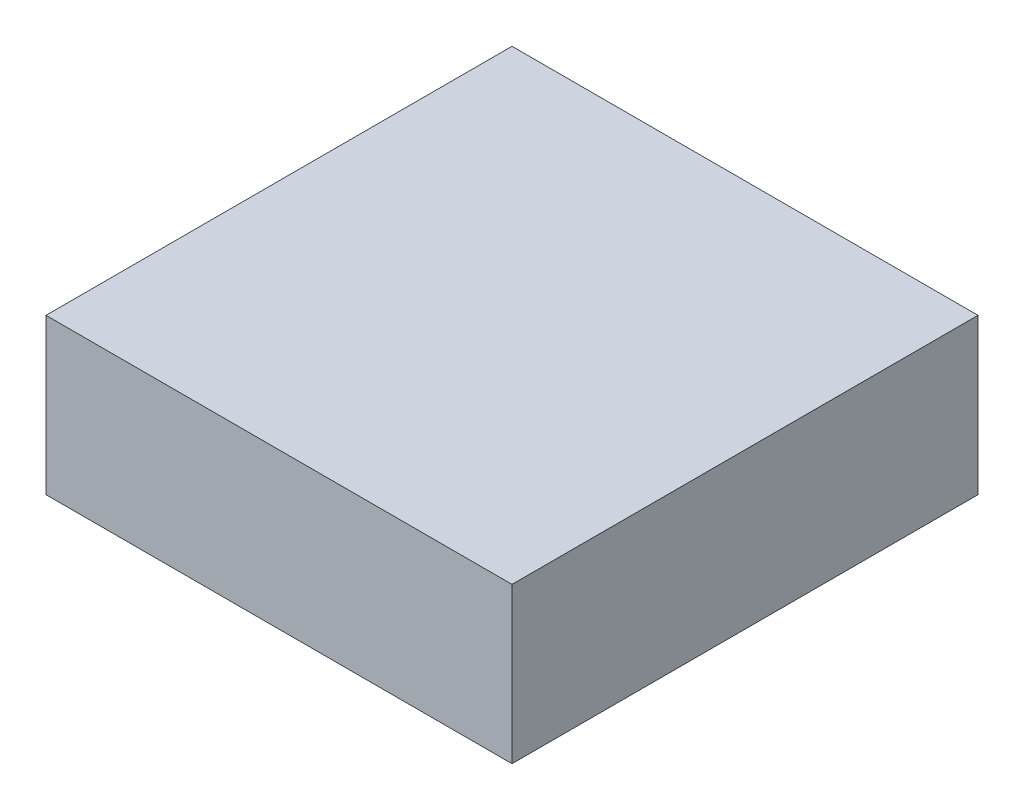
ISO-10303-21;
HEADER;
FILE_DESCRIPTION(('STEP AP214'),'2;1');
FILE_NAME('part.step','',(''),(''),'','','');
FILE_SCHEMA(('AUTOMOTIVE_DESIGN { 1 0 10303 214 1 1 1 1 }'));
ENDSEC;
DATA;
#1=APPLICATION_CONTEXT('core data for automotive mechanical design processes');
#2=APPLICATION_PROTOCOL_DEFINITION('international standard','automotive_design',2000,#1);
#3=PRODUCT_CONTEXT('',#1,'mechanical');
#4=PRODUCT('Part','Part','',(#3));
#5=PRODUCT_RELATED_PRODUCT_CATEGORY('part','',(#4));
#6=PRODUCT_DEFINITION_FORMATION('','',#4);
#7=PRODUCT_DEFINITION_CONTEXT('part definition',#1,'design');
#8=PRODUCT_DEFINITION('design','',#6,#7);
#9=PRODUCT_DEFINITION_SHAPE('','',#8);
#10=(LENGTH_UNIT() NAMED_UNIT(*) SI_UNIT(.MILLI.,.METRE.));
#11=(NAMED_UNIT(*) PLANE_ANGLE_UNIT() SI_UNIT($,.RADIAN.));
#12=(NAMED_UNIT(*) SI_UNIT($,.STERADIAN.) SOLID_ANGLE_UNIT());
#13=UNCERTAINTY_MEASURE_WITH_UNIT(LENGTH_MEASURE(1.E-05),#10,'distance_accuracy_value','');
#14=(GEOMETRIC_REPRESENTATION_CONTEXT(3) GLOBAL_UNCERTAINTY_ASSIGNED_CONTEXT((#13)) GLOBAL_UNIT_ASSIGNED_CONTEXT((#10,
#11,#12)) REPRESENTATION_CONTEXT('',''));
#15=CARTESIAN_POINT('',(0.,0.,0.));
#16=DIRECTION('',(0.,0.,1.));
#17=DIRECTION('',(1.,0.,0.));
#18=AXIS2_PLACEMENT_3D('',#15,#16,#17);
#19=CARTESIAN_POINT('',(0.,0.,0.));
#20=DIRECTION('',(0.,-1.,0.));
#21=DIRECTION('',(0.,0.,-1.));
#22=AXIS2_PLACEMENT_3D('',#19,#20,#21);
#23=PLANE('',#22);
#24=DIRECTION('',(0.,0.,-1.));
#25=VECTOR('',#24,1.);
#26=CARTESIAN_POINT('',(40.5,0.,40.5));
#27=LINE('',#26,#25);
#28=CARTESIAN_POINT('',(40.5,0.,40.5));
#29=VERTEX_POINT('',#28);
#30=CARTESIAN_POINT('',(40.5,0.,-40.5));
#31=VERTEX_POINT('',#30);
#32=EDGE_CURVE('E94',#29,#31,#27,.T.);
#33=ORIENTED_EDGE('',*,*,#32,.F.);
#34=DIRECTION('',(1.,0.,0.));
#35=VECTOR('',#34,1.);
#36=CARTESIAN_POINT('',(-40.5,0.,40.5));
#37=LINE('',#36,#35);
#38=CARTESIAN_POINT('',(-40.5,0.,40.5));
#39=VERTEX_POINT('',#38);
#40=EDGE_CURVE('E74',#39,#29,#37,.T.);
#41=ORIENTED_EDGE('',*,*,#40,.F.);
#42=DIRECTION('',(0.,0.,1.));
#43=VECTOR('',#42,1.);
#44=CARTESIAN_POINT('',(-40.5,0.,40.5));
#45=LINE('',#44,#43);
#46=CARTESIAN_POINT('',(-40.5,0.,-40.5));
#47=VERTEX_POINT('',#46);
#48=EDGE_CURVE('E68',#47,#39,#45,.T.);
#49=ORIENTED_EDGE('',*,*,#48,.F.);
#50=DIRECTION('',(-1.,0.,0.));
#51=VECTOR('',#50,1.);
#52=CARTESIAN_POINT('',(-40.5,0.,-40.5));
#53=LINE('',#52,#51);
#54=EDGE_CURVE('E97',#31,#47,#53,.T.);
#55=ORIENTED_EDGE('',*,*,#54,.F.);
#56=EDGE_LOOP('',(#33,#41,#49,#55));
#57=FACE_BOUND('',#56,.T.);
#58=CARTESIAN_POINT('',(0.,0.,0.));
#59=DIRECTION('',(0.,1.,0.));
#60=DIRECTION('',(-1.,0.,0.));
#61=AXIS2_PLACEMENT_3D('',#58,#59,#60);
#62=CIRCLE('',#61,31.5);
#63=CARTESIAN_POINT('',(-31.5,0.,0.));
#64=VERTEX_POINT('',#63);
#65=EDGE_CURVE('E92',#64,#64,#62,.T.);
#66=ORIENTED_EDGE('',*,*,#65,.T.);
#67=EDGE_LOOP('',(#66));
#68=FACE_BOUND('',#67,.T.);
#69=ADVANCED_FACE('F33',(#57,#68),#23,.T.);
#70=CARTESIAN_POINT('',(40.5,27.,40.5));
#71=DIRECTION('',(-1.,0.,0.));
#72=DIRECTION('',(0.,0.,1.));
#73=AXIS2_PLACEMENT_3D('',#70,#71,#72);
#74=PLANE('',#73);
#75=ORIENTED_EDGE('',*,*,#32,.T.);
#76=DIRECTION('',(0.,-1.,0.));
#77=VECTOR('',#76,1.);
#78=CARTESIAN_POINT('',(40.5,27.,-40.5));
#79=LINE('',#78,#77);
#80=CARTESIAN_POINT('',(40.5,27.,-40.5));
#81=VERTEX_POINT('',#80);
#82=EDGE_CURVE('E11',#81,#31,#79,.T.);
#83=ORIENTED_EDGE('',*,*,#82,.F.);
#84=DIRECTION('',(0.,0.,-1.));
#85=VECTOR('',#84,1.);
#86=CARTESIAN_POINT('',(40.5,27.,40.5));
#87=LINE('',#86,#85);
#88=CARTESIAN_POINT('',(40.5,27.,40.5));
#89=VERTEX_POINT('',#88);
#90=EDGE_CURVE('E104',#89,#81,#87,.T.);
#91=ORIENTED_EDGE('',*,*,#90,.F.);
#92=DIRECTION('',(0.,-1.,0.));
#93=VECTOR('',#92,1.);
#94=CARTESIAN_POINT('',(40.5,27.,40.5));
#95=LINE('',#94,#93);
#96=EDGE_CURVE('E109',#89,#29,#95,.T.);
#97=ORIENTED_EDGE('',*,*,#96,.T.);
#98=EDGE_LOOP('',(#75,#83,#91,#97));
#99=FACE_BOUND('',#98,.T.);
#100=ADVANCED_FACE('F35',(#99),#74,.F.);
#101=CARTESIAN_POINT('',(-40.5,27.,-40.5));
#102=DIRECTION('',(0.,0.,1.));
#103=DIRECTION('',(1.,0.,0.));
#104=AXIS2_PLACEMENT_3D('',#101,#102,#103);
#105=PLANE('',#104);
#106=ORIENTED_EDGE('',*,*,#54,.T.);
#107=DIRECTION('',(0.,-1.,0.));
#108=VECTOR('',#107,1.);
#109=CARTESIAN_POINT('',(-40.5,27.,-40.5));
#110=LINE('',#109,#108);
#111=CARTESIAN_POINT('',(-40.5,27.,-40.5));
#112=VERTEX_POINT('',#111);
#113=EDGE_CURVE('E42',#112,#47,#110,.T.);
#114=ORIENTED_EDGE('',*,*,#113,.F.);
#115=DIRECTION('',(-1.,0.,0.));
#116=VECTOR('',#115,1.);
#117=CARTESIAN_POINT('',(-40.5,27.,-40.5));
#118=LINE('',#117,#116);
#119=EDGE_CURVE('E81',#81,#112,#118,.T.);
#120=ORIENTED_EDGE('',*,*,#119,.F.);
#121=ORIENTED_EDGE('',*,*,#82,.T.);
#122=EDGE_LOOP('',(#106,#114,#120,#121));
#123=FACE_BOUND('',#122,.T.);
#124=ADVANCED_FACE('F131',(#123),#105,.F.);
#125=CARTESIAN_POINT('',(-40.5,27.,40.5));
#126=DIRECTION('',(1.,0.,0.));
#127=DIRECTION('',(0.,0.,-1.));
#128=AXIS2_PLACEMENT_3D('',#125,#126,#127);
#129=PLANE('',#128);
#130=ORIENTED_EDGE('',*,*,#48,.T.);
#131=DIRECTION('',(0.,-1.,0.));
#132=VECTOR('',#131,1.);
#133=CARTESIAN_POINT('',(-40.5,27.,40.5));
#134=LINE('',#133,#132);
#135=CARTESIAN_POINT('',(-40.5,27.,40.5));
#136=VERTEX_POINT('',#135);
#137=EDGE_CURVE('E115',#136,#39,#134,.T.);
#138=ORIENTED_EDGE('',*,*,#137,.F.);
#139=DIRECTION('',(0.,0.,1.));
#140=VECTOR('',#139,1.);
#141=CARTESIAN_POINT('',(-40.5,27.,40.5));
#142=LINE('',#141,#140);
#143=EDGE_CURVE('E107',#112,#136,#142,.T.);
#144=ORIENTED_EDGE('',*,*,#143,.F.);
#145=ORIENTED_EDGE('',*,*,#113,.T.);
#146=EDGE_LOOP('',(#130,#138,#144,#145));
#147=FACE_BOUND('',#146,.T.);
#148=ADVANCED_FACE('F117',(#147),#129,.F.);
#149=CARTESIAN_POINT('',(-40.5,27.,40.5));
#150=DIRECTION('',(0.,0.,-1.));
#151=DIRECTION('',(-1.,0.,0.));
#152=AXIS2_PLACEMENT_3D('',#149,#150,#151);
#153=PLANE('',#152);
#154=ORIENTED_EDGE('',*,*,#40,.T.);
#155=ORIENTED_EDGE('',*,*,#96,.F.);
#156=DIRECTION('',(1.,0.,0.));
#157=VECTOR('',#156,1.);
#158=CARTESIAN_POINT('',(-40.5,27.,40.5));
#159=LINE('',#158,#157);
#160=EDGE_CURVE('E50',#136,#89,#159,.T.);
#161=ORIENTED_EDGE('',*,*,#160,.F.);
#162=ORIENTED_EDGE('',*,*,#137,.T.);
#163=EDGE_LOOP('',(#154,#155,#161,#162));
#164=FACE_BOUND('',#163,.T.);
#165=ADVANCED_FACE('F123',(#164),#153,.F.);
#166=CARTESIAN_POINT('',(0.,27.,0.));
#167=DIRECTION('',(0.,-1.,0.));
#168=DIRECTION('',(0.,0.,-1.));
#169=AXIS2_PLACEMENT_3D('',#166,#167,#168);
#170=PLANE('',#169);
#171=ORIENTED_EDGE('',*,*,#90,.T.);
#172=ORIENTED_EDGE('',*,*,#119,.T.);
#173=ORIENTED_EDGE('',*,*,#143,.T.);
#174=ORIENTED_EDGE('',*,*,#160,.T.);
#175=EDGE_LOOP('',(#171,#172,#173,#174));
#176=FACE_BOUND('',#175,.T.);
#177=ADVANCED_FACE('F88',(#176),#170,.F.);
#178=CARTESIAN_POINT('',(31.5,0.,0.));
#179=CARTESIAN_POINT('',(31.0384816066645,6.45024292906932,0.));
#180=CARTESIAN_POINT('',(25.578767023799,15.0701621582805,0.));
#181=CARTESIAN_POINT('',(10.751491586031,17.1368124459304,0.));
#182=CARTESIAN_POINT('',(4.09022478631182,24.302680673632,0.));
#183=CARTESIAN_POINT('',(1.3714928801771,25.,0.));
#184=CARTESIAN_POINT('',(0.,25.,0.));
#185=B_SPLINE_CURVE_WITH_KNOTS('',3,(#178,#179,#180,#181,#182,#183,#184),.UNSPECIFIED.,.F.,.F.,
(4,1,1,1,4),(0.,0.324542994191198,0.804976685270846,0.908754137946257,1.),.UNSPECIFIED.);
#186=CARTESIAN_POINT('',(0.,10.,0.));
#187=DIRECTION('',(0.,1.,0.));
#188=AXIS1_PLACEMENT('',#186,#187);
#189=SURFACE_OF_REVOLUTION('',#185,#188);
#190=CARTESIAN_POINT('',(0.,25.,0.));
#191=VERTEX_POINT('',#190);
#192=VERTEX_LOOP('',#191);
#193=FACE_BOUND('',#192,.T.);
#194=ORIENTED_EDGE('',*,*,#65,.F.);
#195=EDGE_LOOP('',(#194));
#196=FACE_BOUND('',#195,.T.);
#197=ADVANCED_FACE('F85',(#193,#196),#189,.F.);
#198=CLOSED_SHELL('',(#69,#100,#124,#148,#165,#177,#197));
#199=MANIFOLD_SOLID_BREP('B2',#198);
#200=ADVANCED_BREP_SHAPE_REPRESENTATION('',(#18,#199),#14);
#201=SHAPE_DEFINITION_REPRESENTATION(#9,#200);
ENDSEC;
END-ISO-10303-21;
